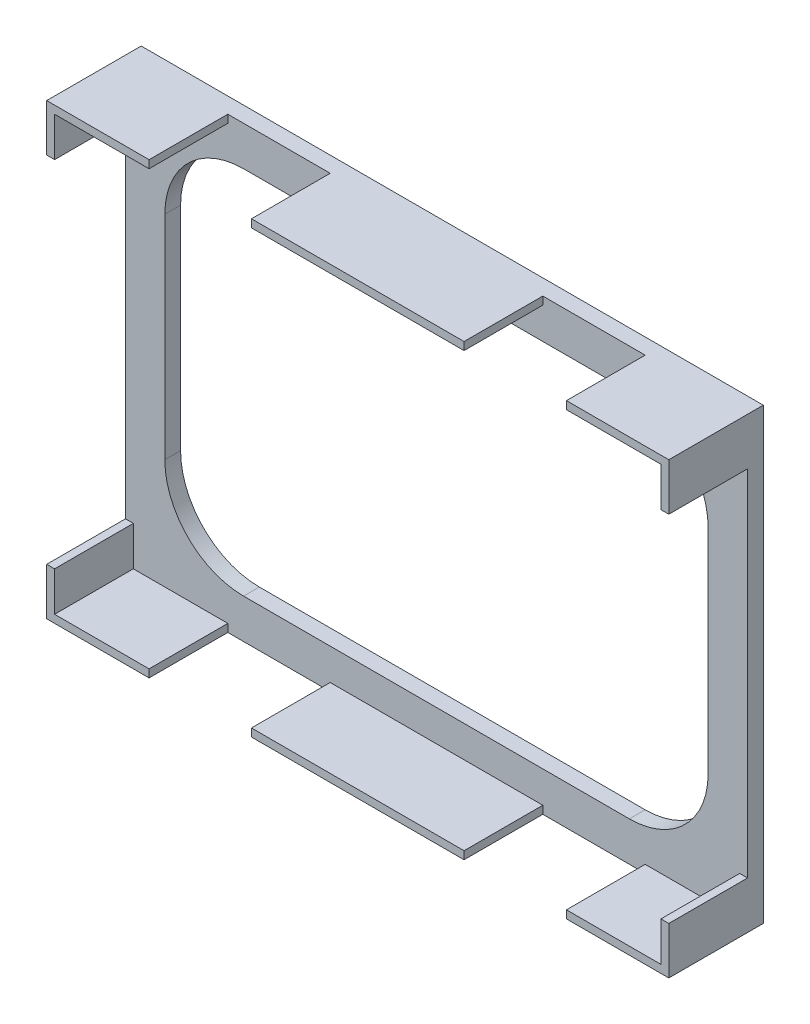
ISO-10303-21;
HEADER;
FILE_DESCRIPTION(('STEP AP214'),'2;1');
FILE_NAME('part.step','',(''),(''),'','','');
FILE_SCHEMA(('AUTOMOTIVE_DESIGN { 1 0 10303 214 1 1 1 1 }'));
ENDSEC;
DATA;
#1=APPLICATION_CONTEXT('core data for automotive mechanical design processes');
#2=APPLICATION_PROTOCOL_DEFINITION('international standard','automotive_design',2000,#1);
#3=PRODUCT_CONTEXT('',#1,'mechanical');
#4=PRODUCT('Part','Part','',(#3));
#5=PRODUCT_RELATED_PRODUCT_CATEGORY('part','',(#4));
#6=PRODUCT_DEFINITION_FORMATION('','',#4);
#7=PRODUCT_DEFINITION_CONTEXT('part definition',#1,'design');
#8=PRODUCT_DEFINITION('design','',#6,#7);
#9=PRODUCT_DEFINITION_SHAPE('','',#8);
#10=(LENGTH_UNIT() NAMED_UNIT(*) SI_UNIT(.MILLI.,.METRE.));
#11=(NAMED_UNIT(*) PLANE_ANGLE_UNIT() SI_UNIT($,.RADIAN.));
#12=(NAMED_UNIT(*) SI_UNIT($,.STERADIAN.) SOLID_ANGLE_UNIT());
#13=UNCERTAINTY_MEASURE_WITH_UNIT(LENGTH_MEASURE(1.E-05),#10,'distance_accuracy_value','');
#14=(GEOMETRIC_REPRESENTATION_CONTEXT(3) GLOBAL_UNCERTAINTY_ASSIGNED_CONTEXT((#13)) GLOBAL_UNIT_ASSIGNED_CONTEXT((#10,
#11,#12)) REPRESENTATION_CONTEXT('',''));
#15=CARTESIAN_POINT('',(0.,0.,0.));
#16=DIRECTION('',(0.,0.,1.));
#17=DIRECTION('',(1.,0.,0.));
#18=AXIS2_PLACEMENT_3D('',#15,#16,#17);
#19=CARTESIAN_POINT('',(0.,0.,12.));
#20=DIRECTION('',(0.,0.,-1.));
#21=DIRECTION('',(-1.,0.,0.));
#22=AXIS2_PLACEMENT_3D('',#19,#20,#21);
#23=PLANE('',#22);
#24=DIRECTION('',(1.,0.,0.));
#25=VECTOR('',#24,1.);
#26=CARTESIAN_POINT('',(1.00000000000001,1.00000000000001,12.));
#27=LINE('',#26,#25);
#28=CARTESIAN_POINT('',(26.,1.,12.));
#29=VERTEX_POINT('',#28);
#30=CARTESIAN_POINT('',(53.,1.,12.));
#31=VERTEX_POINT('',#30);
#32=EDGE_CURVE('E365',#29,#31,#27,.T.);
#33=ORIENTED_EDGE('',*,*,#32,.F.);
#34=DIRECTION('',(0.,-1.,0.));
#35=VECTOR('',#34,1.);
#36=CARTESIAN_POINT('',(26.,100.,12.));
#37=LINE('',#36,#35);
#38=CARTESIAN_POINT('',(26.,0.,12.));
#39=VERTEX_POINT('',#38);
#40=EDGE_CURVE('E496',#29,#39,#37,.T.);
#41=ORIENTED_EDGE('',*,*,#40,.T.);
#42=DIRECTION('',(1.,0.,0.));
#43=VECTOR('',#42,1.);
#44=CARTESIAN_POINT('',(0.,0.,12.));
#45=LINE('',#44,#43);
#46=CARTESIAN_POINT('',(53.,0.,12.));
#47=VERTEX_POINT('',#46);
#48=EDGE_CURVE('E320',#39,#47,#45,.T.);
#49=ORIENTED_EDGE('',*,*,#48,.T.);
#50=DIRECTION('',(0.,-1.,0.));
#51=VECTOR('',#50,1.);
#52=CARTESIAN_POINT('',(53.,100.,12.));
#53=LINE('',#52,#51);
#54=EDGE_CURVE('E474',#31,#47,#53,.T.);
#55=ORIENTED_EDGE('',*,*,#54,.F.);
#56=EDGE_LOOP('',(#33,#41,#49,#55));
#57=FACE_BOUND('',#56,.T.);
#58=ADVANCED_FACE('F33',(#57),#23,.F.);
#59=CARTESIAN_POINT('',(66.,1.,12.));
#60=VERTEX_POINT('',#59);
#61=CARTESIAN_POINT('',(78.,1.00000000000001,12.));
#62=VERTEX_POINT('',#61);
#63=EDGE_CURVE('E366',#60,#62,#27,.T.);
#64=ORIENTED_EDGE('',*,*,#63,.F.);
#65=DIRECTION('',(0.,-1.,0.));
#66=VECTOR('',#65,1.);
#67=CARTESIAN_POINT('',(66.,100.,12.));
#68=LINE('',#67,#66);
#69=CARTESIAN_POINT('',(66.,0.,12.));
#70=VERTEX_POINT('',#69);
#71=EDGE_CURVE('E470',#60,#70,#68,.T.);
#72=ORIENTED_EDGE('',*,*,#71,.T.);
#73=CARTESIAN_POINT('',(79.,0.,12.));
#74=VERTEX_POINT('',#73);
#75=EDGE_CURVE('E322',#70,#74,#45,.T.);
#76=ORIENTED_EDGE('',*,*,#75,.T.);
#77=DIRECTION('',(0.,1.,0.));
#78=VECTOR('',#77,1.);
#79=CARTESIAN_POINT('',(79.,0.,12.));
#80=LINE('',#79,#78);
#81=CARTESIAN_POINT('',(79.,6.,12.));
#82=VERTEX_POINT('',#81);
#83=EDGE_CURVE('E323',#74,#82,#80,.T.);
#84=ORIENTED_EDGE('',*,*,#83,.T.);
#85=DIRECTION('',(1.,0.,0.));
#86=VECTOR('',#85,1.);
#87=CARTESIAN_POINT('',(-21.,6.,12.));
#88=LINE('',#87,#86);
#89=CARTESIAN_POINT('',(78.,6.,12.));
#90=VERTEX_POINT('',#89);
#91=EDGE_CURVE('E417',#90,#82,#88,.T.);
#92=ORIENTED_EDGE('',*,*,#91,.F.);
#93=DIRECTION('',(0.,1.,0.));
#94=VECTOR('',#93,1.);
#95=CARTESIAN_POINT('',(78.,1.00000000000001,12.));
#96=LINE('',#95,#94);
#97=EDGE_CURVE('E359',#62,#90,#96,.T.);
#98=ORIENTED_EDGE('',*,*,#97,.F.);
#99=EDGE_LOOP('',(#64,#72,#76,#84,#92,#98));
#100=FACE_BOUND('',#99,.T.);
#101=ADVANCED_FACE('F588',(#100),#23,.F.);
#102=DIRECTION('',(-1.,0.,0.));
#103=VECTOR('',#102,1.);
#104=CARTESIAN_POINT('',(0.,57.,12.));
#105=LINE('',#104,#103);
#106=CARTESIAN_POINT('',(53.,57.,12.));
#107=VERTEX_POINT('',#106);
#108=CARTESIAN_POINT('',(26.,57.,12.));
#109=VERTEX_POINT('',#108);
#110=EDGE_CURVE('E645',#107,#109,#105,.T.);
#111=ORIENTED_EDGE('',*,*,#110,.T.);
#112=CARTESIAN_POINT('',(26.,56.,12.));
#113=VERTEX_POINT('',#112);
#114=EDGE_CURVE('E469',#109,#113,#37,.T.);
#115=ORIENTED_EDGE('',*,*,#114,.T.);
#116=DIRECTION('',(-1.,0.,0.));
#117=VECTOR('',#116,1.);
#118=CARTESIAN_POINT('',(1.00000000000001,56.,12.));
#119=LINE('',#118,#117);
#120=CARTESIAN_POINT('',(53.,56.,12.));
#121=VERTEX_POINT('',#120);
#122=EDGE_CURVE('E357',#121,#113,#119,.T.);
#123=ORIENTED_EDGE('',*,*,#122,.F.);
#124=EDGE_CURVE('E476',#107,#121,#53,.T.);
#125=ORIENTED_EDGE('',*,*,#124,.F.);
#126=EDGE_LOOP('',(#111,#115,#123,#125));
#127=FACE_BOUND('',#126,.T.);
#128=ADVANCED_FACE('F595',(#127),#23,.F.);
#129=CARTESIAN_POINT('',(79.,57.,12.));
#130=VERTEX_POINT('',#129);
#131=CARTESIAN_POINT('',(66.,57.,12.));
#132=VERTEX_POINT('',#131);
#133=EDGE_CURVE('E639',#130,#132,#105,.T.);
#134=ORIENTED_EDGE('',*,*,#133,.T.);
#135=CARTESIAN_POINT('',(66.,56.,12.));
#136=VERTEX_POINT('',#135);
#137=EDGE_CURVE('E472',#132,#136,#68,.T.);
#138=ORIENTED_EDGE('',*,*,#137,.T.);
#139=CARTESIAN_POINT('',(78.,56.,12.));
#140=VERTEX_POINT('',#139);
#141=EDGE_CURVE('E353',#140,#136,#119,.T.);
#142=ORIENTED_EDGE('',*,*,#141,.F.);
#143=CARTESIAN_POINT('',(78.,51.,12.));
#144=VERTEX_POINT('',#143);
#145=EDGE_CURVE('E362',#144,#140,#96,.T.);
#146=ORIENTED_EDGE('',*,*,#145,.F.);
#147=DIRECTION('',(1.,0.,0.));
#148=VECTOR('',#147,1.);
#149=CARTESIAN_POINT('',(-21.,51.,12.));
#150=LINE('',#149,#148);
#151=CARTESIAN_POINT('',(79.,51.,12.));
#152=VERTEX_POINT('',#151);
#153=EDGE_CURVE('E413',#144,#152,#150,.T.);
#154=ORIENTED_EDGE('',*,*,#153,.T.);
#155=EDGE_CURVE('E319',#152,#130,#80,.T.);
#156=ORIENTED_EDGE('',*,*,#155,.T.);
#157=EDGE_LOOP('',(#134,#138,#142,#146,#154,#156));
#158=FACE_BOUND('',#157,.T.);
#159=ADVANCED_FACE('F613',(#158),#23,.F.);
#160=CARTESIAN_POINT('',(1.00000000000001,56.,2.));
#161=DIRECTION('',(0.,1.,0.));
#162=DIRECTION('',(0.,0.,1.));
#163=AXIS2_PLACEMENT_3D('',#160,#161,#162);
#164=PLANE('',#163);
#165=ORIENTED_EDGE('',*,*,#122,.T.);
#166=DIRECTION('',(0.,0.,-1.));
#167=VECTOR('',#166,1.);
#168=CARTESIAN_POINT('',(26.,56.,2.));
#169=LINE('',#168,#167);
#170=CARTESIAN_POINT('',(26.,56.,2.));
#171=VERTEX_POINT('',#170);
#172=EDGE_CURVE('E438',#113,#171,#169,.T.);
#173=ORIENTED_EDGE('',*,*,#172,.T.);
#174=DIRECTION('',(-1.,0.,0.));
#175=VECTOR('',#174,1.);
#176=CARTESIAN_POINT('',(1.00000000000001,56.,2.));
#177=LINE('',#176,#175);
#178=CARTESIAN_POINT('',(53.,56.,2.));
#179=VERTEX_POINT('',#178);
#180=EDGE_CURVE('E373',#179,#171,#177,.T.);
#181=ORIENTED_EDGE('',*,*,#180,.F.);
#182=DIRECTION('',(0.,0.,1.));
#183=VECTOR('',#182,1.);
#184=CARTESIAN_POINT('',(53.,56.,2.));
#185=LINE('',#184,#183);
#186=EDGE_CURVE('E463',#179,#121,#185,.T.);
#187=ORIENTED_EDGE('',*,*,#186,.T.);
#188=EDGE_LOOP('',(#165,#173,#181,#187));
#189=FACE_BOUND('',#188,.T.);
#190=ADVANCED_FACE('F625',(#189),#164,.F.);
#191=ORIENTED_EDGE('',*,*,#141,.T.);
#192=DIRECTION('',(0.,0.,-1.));
#193=VECTOR('',#192,1.);
#194=CARTESIAN_POINT('',(66.,56.,2.));
#195=LINE('',#194,#193);
#196=CARTESIAN_POINT('',(66.,56.,2.));
#197=VERTEX_POINT('',#196);
#198=EDGE_CURVE('E454',#136,#197,#195,.T.);
#199=ORIENTED_EDGE('',*,*,#198,.T.);
#200=CARTESIAN_POINT('',(78.,56.,2.));
#201=VERTEX_POINT('',#200);
#202=EDGE_CURVE('E343',#201,#197,#177,.T.);
#203=ORIENTED_EDGE('',*,*,#202,.F.);
#204=DIRECTION('',(0.,0.,1.));
#205=VECTOR('',#204,1.);
#206=CARTESIAN_POINT('',(78.,56.,2.));
#207=LINE('',#206,#205);
#208=EDGE_CURVE('E346',#201,#140,#207,.T.);
#209=ORIENTED_EDGE('',*,*,#208,.T.);
#210=EDGE_LOOP('',(#191,#199,#203,#209));
#211=FACE_BOUND('',#210,.T.);
#212=ADVANCED_FACE('F631',(#211),#164,.F.);
#213=CARTESIAN_POINT('',(1.00000000000001,1.00000000000001,2.));
#214=DIRECTION('',(0.,-1.,0.));
#215=DIRECTION('',(0.,0.,-1.));
#216=AXIS2_PLACEMENT_3D('',#213,#214,#215);
#217=PLANE('',#216);
#218=DIRECTION('',(1.,0.,0.));
#219=VECTOR('',#218,1.);
#220=CARTESIAN_POINT('',(1.00000000000001,1.00000000000001,2.));
#221=LINE('',#220,#219);
#222=CARTESIAN_POINT('',(26.,1.,2.));
#223=VERTEX_POINT('',#222);
#224=CARTESIAN_POINT('',(53.,1.00000000000001,2.));
#225=VERTEX_POINT('',#224);
#226=EDGE_CURVE('E382',#223,#225,#221,.T.);
#227=ORIENTED_EDGE('',*,*,#226,.F.);
#228=DIRECTION('',(0.,0.,1.));
#229=VECTOR('',#228,1.);
#230=CARTESIAN_POINT('',(26.,1.00000000000001,2.));
#231=LINE('',#230,#229);
#232=EDGE_CURVE('E441',#223,#29,#231,.T.);
#233=ORIENTED_EDGE('',*,*,#232,.T.);
#234=ORIENTED_EDGE('',*,*,#32,.T.);
#235=DIRECTION('',(0.,0.,-1.));
#236=VECTOR('',#235,1.);
#237=CARTESIAN_POINT('',(53.,1.00000000000001,2.));
#238=LINE('',#237,#236);
#239=EDGE_CURVE('E466',#31,#225,#238,.T.);
#240=ORIENTED_EDGE('',*,*,#239,.T.);
#241=EDGE_LOOP('',(#227,#233,#234,#240));
#242=FACE_BOUND('',#241,.T.);
#243=ADVANCED_FACE('F620',(#242),#217,.F.);
#244=CARTESIAN_POINT('',(66.,1.,2.));
#245=VERTEX_POINT('',#244);
#246=CARTESIAN_POINT('',(78.,1.00000000000001,2.));
#247=VERTEX_POINT('',#246);
#248=EDGE_CURVE('E383',#245,#247,#221,.T.);
#249=ORIENTED_EDGE('',*,*,#248,.F.);
#250=DIRECTION('',(0.,0.,1.));
#251=VECTOR('',#250,1.);
#252=CARTESIAN_POINT('',(66.,1.00000000000001,2.));
#253=LINE('',#252,#251);
#254=EDGE_CURVE('E457',#245,#60,#253,.T.);
#255=ORIENTED_EDGE('',*,*,#254,.T.);
#256=ORIENTED_EDGE('',*,*,#63,.T.);
#257=DIRECTION('',(0.,0.,1.));
#258=VECTOR('',#257,1.);
#259=CARTESIAN_POINT('',(78.,1.00000000000001,2.));
#260=LINE('',#259,#258);
#261=EDGE_CURVE('E342',#247,#62,#260,.T.);
#262=ORIENTED_EDGE('',*,*,#261,.F.);
#263=EDGE_LOOP('',(#249,#255,#256,#262));
#264=FACE_BOUND('',#263,.T.);
#265=ADVANCED_FACE('F612',(#264),#217,.F.);
#266=CARTESIAN_POINT('',(0.,0.,12.));
#267=VERTEX_POINT('',#266);
#268=CARTESIAN_POINT('',(13.,0.,12.));
#269=VERTEX_POINT('',#268);
#270=EDGE_CURVE('E308',#267,#269,#45,.T.);
#271=ORIENTED_EDGE('',*,*,#270,.T.);
#272=DIRECTION('',(0.,-1.,0.));
#273=VECTOR('',#272,1.);
#274=CARTESIAN_POINT('',(13.,100.,12.));
#275=LINE('',#274,#273);
#276=CARTESIAN_POINT('',(13.,1.,12.));
#277=VERTEX_POINT('',#276);
#278=EDGE_CURVE('E289',#277,#269,#275,.T.);
#279=ORIENTED_EDGE('',*,*,#278,.F.);
#280=CARTESIAN_POINT('',(1.00000000000001,1.00000000000001,12.));
#281=VERTEX_POINT('',#280);
#282=EDGE_CURVE('E363',#281,#277,#27,.T.);
#283=ORIENTED_EDGE('',*,*,#282,.F.);
#284=DIRECTION('',(0.,-1.,0.));
#285=VECTOR('',#284,1.);
#286=CARTESIAN_POINT('',(1.00000000000001,1.00000000000001,12.));
#287=LINE('',#286,#285);
#288=CARTESIAN_POINT('',(1.00000000000001,6.,12.));
#289=VERTEX_POINT('',#288);
#290=EDGE_CURVE('E370',#289,#281,#287,.T.);
#291=ORIENTED_EDGE('',*,*,#290,.F.);
#292=CARTESIAN_POINT('',(0.,6.,12.));
#293=VERTEX_POINT('',#292);
#294=EDGE_CURVE('E419',#293,#289,#88,.T.);
#295=ORIENTED_EDGE('',*,*,#294,.F.);
#296=DIRECTION('',(0.,-1.,0.));
#297=VECTOR('',#296,1.);
#298=CARTESIAN_POINT('',(0.,0.,12.));
#299=LINE('',#298,#297);
#300=EDGE_CURVE('E318',#293,#267,#299,.T.);
#301=ORIENTED_EDGE('',*,*,#300,.T.);
#302=EDGE_LOOP('',(#271,#279,#283,#291,#295,#301));
#303=FACE_BOUND('',#302,.T.);
#304=ADVANCED_FACE('F315',(#303),#23,.F.);
#305=CARTESIAN_POINT('',(1.00000000000001,1.00000000000001,2.));
#306=DIRECTION('',(-1.,0.,0.));
#307=DIRECTION('',(0.,0.,1.));
#308=AXIS2_PLACEMENT_3D('',#305,#306,#307);
#309=PLANE('',#308);
#310=DIRECTION('',(0.,-1.,0.));
#311=VECTOR('',#310,1.);
#312=CARTESIAN_POINT('',(1.00000000000001,1.00000000000001,2.));
#313=LINE('',#312,#311);
#314=CARTESIAN_POINT('',(1.00000000000001,6.,2.));
#315=VERTEX_POINT('',#314);
#316=CARTESIAN_POINT('',(1.00000000000001,1.00000000000001,2.));
#317=VERTEX_POINT('',#316);
#318=EDGE_CURVE('E356',#315,#317,#313,.T.);
#319=ORIENTED_EDGE('',*,*,#318,.F.);
#320=DIRECTION('',(0.,0.,1.));
#321=VECTOR('',#320,1.);
#322=CARTESIAN_POINT('',(1.00000000000001,6.,2.));
#323=LINE('',#322,#321);
#324=EDGE_CURVE('E393',#315,#289,#323,.T.);
#325=ORIENTED_EDGE('',*,*,#324,.T.);
#326=ORIENTED_EDGE('',*,*,#290,.T.);
#327=DIRECTION('',(0.,0.,1.));
#328=VECTOR('',#327,1.);
#329=CARTESIAN_POINT('',(1.00000000000001,1.00000000000001,2.));
#330=LINE('',#329,#328);
#331=EDGE_CURVE('E339',#317,#281,#330,.T.);
#332=ORIENTED_EDGE('',*,*,#331,.F.);
#333=EDGE_LOOP('',(#319,#325,#326,#332));
#334=FACE_BOUND('',#333,.T.);
#335=ADVANCED_FACE('F611',(#334),#309,.F.);
#336=CARTESIAN_POINT('',(78.,1.00000000000001,2.));
#337=DIRECTION('',(1.,0.,0.));
#338=DIRECTION('',(0.,0.,-1.));
#339=AXIS2_PLACEMENT_3D('',#336,#337,#338);
#340=PLANE('',#339);
#341=ORIENTED_EDGE('',*,*,#97,.T.);
#342=DIRECTION('',(0.,0.,-1.));
#343=VECTOR('',#342,1.);
#344=CARTESIAN_POINT('',(78.,6.,2.));
#345=LINE('',#344,#343);
#346=CARTESIAN_POINT('',(78.,6.,2.));
#347=VERTEX_POINT('',#346);
#348=EDGE_CURVE('E396',#90,#347,#345,.T.);
#349=ORIENTED_EDGE('',*,*,#348,.T.);
#350=DIRECTION('',(0.,1.,0.));
#351=VECTOR('',#350,1.);
#352=CARTESIAN_POINT('',(78.,1.00000000000001,2.));
#353=LINE('',#352,#351);
#354=EDGE_CURVE('E375',#247,#347,#353,.T.);
#355=ORIENTED_EDGE('',*,*,#354,.F.);
#356=ORIENTED_EDGE('',*,*,#261,.T.);
#357=EDGE_LOOP('',(#341,#349,#355,#356));
#358=FACE_BOUND('',#357,.T.);
#359=ADVANCED_FACE('F618',(#358),#340,.F.);
#360=CARTESIAN_POINT('',(0.,0.,12.));
#361=DIRECTION('',(1.,0.,0.));
#362=DIRECTION('',(0.,0.,-1.));
#363=AXIS2_PLACEMENT_3D('',#360,#361,#362);
#364=PLANE('',#363);
#365=ORIENTED_EDGE('',*,*,#300,.F.);
#366=DIRECTION('',(0.,0.,-1.));
#367=VECTOR('',#366,1.);
#368=CARTESIAN_POINT('',(0.,6.,12.));
#369=LINE('',#368,#367);
#370=CARTESIAN_POINT('',(0.,6.,2.));
#371=VERTEX_POINT('',#370);
#372=EDGE_CURVE('E390',#293,#371,#369,.T.);
#373=ORIENTED_EDGE('',*,*,#372,.T.);
#374=DIRECTION('',(0.,1.,0.));
#375=VECTOR('',#374,1.);
#376=CARTESIAN_POINT('',(0.,0.,2.));
#377=LINE('',#376,#375);
#378=CARTESIAN_POINT('',(0.,51.,2.));
#379=VERTEX_POINT('',#378);
#380=EDGE_CURVE('E387',#371,#379,#377,.T.);
#381=ORIENTED_EDGE('',*,*,#380,.T.);
#382=DIRECTION('',(0.,0.,1.));
#383=VECTOR('',#382,1.);
#384=CARTESIAN_POINT('',(0.,51.,12.));
#385=LINE('',#384,#383);
#386=CARTESIAN_POINT('',(0.,51.,12.));
#387=VERTEX_POINT('',#386);
#388=EDGE_CURVE('E399',#379,#387,#385,.T.);
#389=ORIENTED_EDGE('',*,*,#388,.T.);
#390=CARTESIAN_POINT('',(0.,57.,12.));
#391=VERTEX_POINT('',#390);
#392=EDGE_CURVE('E327',#391,#387,#299,.T.);
#393=ORIENTED_EDGE('',*,*,#392,.F.);
#394=DIRECTION('',(0.,0.,-1.));
#395=VECTOR('',#394,1.);
#396=CARTESIAN_POINT('',(0.,57.,12.));
#397=LINE('',#396,#395);
#398=CARTESIAN_POINT('',(0.,57.,0.));
#399=VERTEX_POINT('',#398);
#400=EDGE_CURVE('E644',#391,#399,#397,.T.);
#401=ORIENTED_EDGE('',*,*,#400,.T.);
#402=DIRECTION('',(0.,-1.,0.));
#403=VECTOR('',#402,1.);
#404=CARTESIAN_POINT('',(0.,0.,0.));
#405=LINE('',#404,#403);
#406=CARTESIAN_POINT('',(0.,0.,0.));
#407=VERTEX_POINT('',#406);
#408=EDGE_CURVE('E352',#399,#407,#405,.T.);
#409=ORIENTED_EDGE('',*,*,#408,.T.);
#410=DIRECTION('',(0.,0.,-1.));
#411=VECTOR('',#410,1.);
#412=CARTESIAN_POINT('',(0.,0.,12.));
#413=LINE('',#412,#411);
#414=EDGE_CURVE('E575',#267,#407,#413,.T.);
#415=ORIENTED_EDGE('',*,*,#414,.F.);
#416=EDGE_LOOP('',(#365,#373,#381,#389,#393,#401,#409,#415));
#417=FACE_BOUND('',#416,.T.);
#418=ADVANCED_FACE('F734',(#417),#364,.F.);
#419=CARTESIAN_POINT('',(0.,0.,12.));
#420=DIRECTION('',(0.,1.,0.));
#421=DIRECTION('',(0.,0.,1.));
#422=AXIS2_PLACEMENT_3D('',#419,#420,#421);
#423=PLANE('',#422);
#424=ORIENTED_EDGE('',*,*,#48,.F.);
#425=DIRECTION('',(0.,0.,1.));
#426=VECTOR('',#425,1.);
#427=CARTESIAN_POINT('',(26.,0.,2.));
#428=LINE('',#427,#426);
#429=CARTESIAN_POINT('',(26.,0.,2.));
#430=VERTEX_POINT('',#429);
#431=EDGE_CURVE('E301',#430,#39,#428,.T.);
#432=ORIENTED_EDGE('',*,*,#431,.F.);
#433=DIRECTION('',(1.,0.,0.));
#434=VECTOR('',#433,1.);
#435=CARTESIAN_POINT('',(13.,0.,2.));
#436=LINE('',#435,#434);
#437=CARTESIAN_POINT('',(13.,0.,2.));
#438=VERTEX_POINT('',#437);
#439=EDGE_CURVE('E312',#438,#430,#436,.T.);
#440=ORIENTED_EDGE('',*,*,#439,.F.);
#441=DIRECTION('',(0.,0.,-1.));
#442=VECTOR('',#441,1.);
#443=CARTESIAN_POINT('',(13.,0.,2.));
#444=LINE('',#443,#442);
#445=EDGE_CURVE('E292',#269,#438,#444,.T.);
#446=ORIENTED_EDGE('',*,*,#445,.F.);
#447=ORIENTED_EDGE('',*,*,#270,.F.);
#448=ORIENTED_EDGE('',*,*,#414,.T.);
#449=DIRECTION('',(1.,0.,0.));
#450=VECTOR('',#449,1.);
#451=CARTESIAN_POINT('',(0.,0.,0.));
#452=LINE('',#451,#450);
#453=CARTESIAN_POINT('',(79.,0.,0.));
#454=VERTEX_POINT('',#453);
#455=EDGE_CURVE('E746',#407,#454,#452,.T.);
#456=ORIENTED_EDGE('',*,*,#455,.T.);
#457=DIRECTION('',(0.,0.,-1.));
#458=VECTOR('',#457,1.);
#459=CARTESIAN_POINT('',(79.,0.,12.));
#460=LINE('',#459,#458);
#461=EDGE_CURVE('E664',#74,#454,#460,.T.);
#462=ORIENTED_EDGE('',*,*,#461,.F.);
#463=ORIENTED_EDGE('',*,*,#75,.F.);
#464=DIRECTION('',(0.,0.,1.));
#465=VECTOR('',#464,1.);
#466=CARTESIAN_POINT('',(66.,0.,2.));
#467=LINE('',#466,#465);
#468=CARTESIAN_POINT('',(66.,0.,2.));
#469=VERTEX_POINT('',#468);
#470=EDGE_CURVE('E487',#469,#70,#467,.T.);
#471=ORIENTED_EDGE('',*,*,#470,.F.);
#472=DIRECTION('',(1.,0.,0.));
#473=VECTOR('',#472,1.);
#474=CARTESIAN_POINT('',(53.,0.,2.));
#475=LINE('',#474,#473);
#476=CARTESIAN_POINT('',(53.,0.,2.));
#477=VERTEX_POINT('',#476);
#478=EDGE_CURVE('E473',#477,#469,#475,.T.);
#479=ORIENTED_EDGE('',*,*,#478,.F.);
#480=DIRECTION('',(0.,0.,-1.));
#481=VECTOR('',#480,1.);
#482=CARTESIAN_POINT('',(53.,0.,2.));
#483=LINE('',#482,#481);
#484=EDGE_CURVE('E484',#47,#477,#483,.T.);
#485=ORIENTED_EDGE('',*,*,#484,.F.);
#486=EDGE_LOOP('',(#424,#432,#440,#446,#447,#448,#456,#462,#463,#471,#479,#485));
#487=FACE_BOUND('',#486,.T.);
#488=ADVANCED_FACE('F306',(#487),#423,.F.);
#489=CARTESIAN_POINT('',(79.,0.,12.));
#490=DIRECTION('',(-1.,0.,0.));
#491=DIRECTION('',(0.,0.,1.));
#492=AXIS2_PLACEMENT_3D('',#489,#490,#491);
#493=PLANE('',#492);
#494=DIRECTION('',(0.,1.,0.));
#495=VECTOR('',#494,1.);
#496=CARTESIAN_POINT('',(79.,6.,2.));
#497=LINE('',#496,#495);
#498=CARTESIAN_POINT('',(79.,6.,2.));
#499=VERTEX_POINT('',#498);
#500=CARTESIAN_POINT('',(79.,51.,2.));
#501=VERTEX_POINT('',#500);
#502=EDGE_CURVE('E426',#499,#501,#497,.T.);
#503=ORIENTED_EDGE('',*,*,#502,.F.);
#504=DIRECTION('',(0.,0.,-1.));
#505=VECTOR('',#504,1.);
#506=CARTESIAN_POINT('',(79.,6.,2.));
#507=LINE('',#506,#505);
#508=EDGE_CURVE('E412',#82,#499,#507,.T.);
#509=ORIENTED_EDGE('',*,*,#508,.F.);
#510=ORIENTED_EDGE('',*,*,#83,.F.);
#511=ORIENTED_EDGE('',*,*,#461,.T.);
#512=DIRECTION('',(0.,1.,0.));
#513=VECTOR('',#512,1.);
#514=CARTESIAN_POINT('',(79.,0.,0.));
#515=LINE('',#514,#513);
#516=CARTESIAN_POINT('',(79.,57.,0.));
#517=VERTEX_POINT('',#516);
#518=EDGE_CURVE('E744',#454,#517,#515,.T.);
#519=ORIENTED_EDGE('',*,*,#518,.T.);
#520=DIRECTION('',(0.,0.,-1.));
#521=VECTOR('',#520,1.);
#522=CARTESIAN_POINT('',(79.,57.,12.));
#523=LINE('',#522,#521);
#524=EDGE_CURVE('E649',#130,#517,#523,.T.);
#525=ORIENTED_EDGE('',*,*,#524,.F.);
#526=ORIENTED_EDGE('',*,*,#155,.F.);
#527=DIRECTION('',(0.,0.,1.));
#528=VECTOR('',#527,1.);
#529=CARTESIAN_POINT('',(79.,51.,2.));
#530=LINE('',#529,#528);
#531=EDGE_CURVE('E424',#501,#152,#530,.T.);
#532=ORIENTED_EDGE('',*,*,#531,.F.);
#533=EDGE_LOOP('',(#503,#509,#510,#511,#519,#525,#526,#532));
#534=FACE_BOUND('',#533,.T.);
#535=ADVANCED_FACE('F606',(#534),#493,.F.);
#536=CARTESIAN_POINT('',(0.,57.,12.));
#537=DIRECTION('',(0.,-1.,0.));
#538=DIRECTION('',(0.,0.,-1.));
#539=AXIS2_PLACEMENT_3D('',#536,#537,#538);
#540=PLANE('',#539);
#541=DIRECTION('',(1.,0.,0.));
#542=VECTOR('',#541,1.);
#543=CARTESIAN_POINT('',(0.,57.,2.));
#544=LINE('',#543,#542);
#545=CARTESIAN_POINT('',(13.,57.,2.));
#546=VERTEX_POINT('',#545);
#547=CARTESIAN_POINT('',(26.,57.,2.));
#548=VERTEX_POINT('',#547);
#549=EDGE_CURVE('E429',#546,#548,#544,.T.);
#550=ORIENTED_EDGE('',*,*,#549,.T.);
#551=DIRECTION('',(0.,0.,1.));
#552=VECTOR('',#551,1.);
#553=CARTESIAN_POINT('',(26.,57.,12.));
#554=LINE('',#553,#552);
#555=EDGE_CURVE('E435',#548,#109,#554,.T.);
#556=ORIENTED_EDGE('',*,*,#555,.T.);
#557=ORIENTED_EDGE('',*,*,#110,.F.);
#558=DIRECTION('',(0.,0.,-1.));
#559=VECTOR('',#558,1.);
#560=CARTESIAN_POINT('',(53.,57.,12.));
#561=LINE('',#560,#559);
#562=CARTESIAN_POINT('',(53.,57.,2.));
#563=VERTEX_POINT('',#562);
#564=EDGE_CURVE('E460',#107,#563,#561,.T.);
#565=ORIENTED_EDGE('',*,*,#564,.T.);
#566=DIRECTION('',(1.,0.,0.));
#567=VECTOR('',#566,1.);
#568=CARTESIAN_POINT('',(0.,57.,2.));
#569=LINE('',#568,#567);
#570=CARTESIAN_POINT('',(66.,57.,2.));
#571=VERTEX_POINT('',#570);
#572=EDGE_CURVE('E432',#563,#571,#569,.T.);
#573=ORIENTED_EDGE('',*,*,#572,.T.);
#574=DIRECTION('',(0.,0.,1.));
#575=VECTOR('',#574,1.);
#576=CARTESIAN_POINT('',(66.,57.,12.));
#577=LINE('',#576,#575);
#578=EDGE_CURVE('E451',#571,#132,#577,.T.);
#579=ORIENTED_EDGE('',*,*,#578,.T.);
#580=ORIENTED_EDGE('',*,*,#133,.F.);
#581=ORIENTED_EDGE('',*,*,#524,.T.);
#582=DIRECTION('',(-1.,0.,0.));
#583=VECTOR('',#582,1.);
#584=CARTESIAN_POINT('',(0.,57.,0.));
#585=LINE('',#584,#583);
#586=EDGE_CURVE('E337',#517,#399,#585,.T.);
#587=ORIENTED_EDGE('',*,*,#586,.T.);
#588=ORIENTED_EDGE('',*,*,#400,.F.);
#589=CARTESIAN_POINT('',(13.,57.,12.));
#590=VERTEX_POINT('',#589);
#591=EDGE_CURVE('E647',#590,#391,#105,.T.);
#592=ORIENTED_EDGE('',*,*,#591,.F.);
#593=DIRECTION('',(0.,0.,-1.));
#594=VECTOR('',#593,1.);
#595=CARTESIAN_POINT('',(13.,57.,12.));
#596=LINE('',#595,#594);
#597=EDGE_CURVE('E444',#590,#546,#596,.T.);
#598=ORIENTED_EDGE('',*,*,#597,.T.);
#599=EDGE_LOOP('',(#550,#556,#557,#565,#573,#579,#580,#581,#587,#588,#592,#598));
#600=FACE_BOUND('',#599,.T.);
#601=ADVANCED_FACE('F600',(#600),#540,.F.);
#602=CARTESIAN_POINT('',(13.,56.,12.));
#603=VERTEX_POINT('',#602);
#604=CARTESIAN_POINT('',(1.00000000000001,56.,12.));
#605=VERTEX_POINT('',#604);
#606=EDGE_CURVE('E358',#603,#605,#119,.T.);
#607=ORIENTED_EDGE('',*,*,#606,.F.);
#608=EDGE_CURVE('E300',#590,#603,#275,.T.);
#609=ORIENTED_EDGE('',*,*,#608,.F.);
#610=ORIENTED_EDGE('',*,*,#591,.T.);
#611=ORIENTED_EDGE('',*,*,#392,.T.);
#612=CARTESIAN_POINT('',(1.00000000000001,51.,12.));
#613=VERTEX_POINT('',#612);
#614=EDGE_CURVE('E416',#387,#613,#150,.T.);
#615=ORIENTED_EDGE('',*,*,#614,.T.);
#616=EDGE_CURVE('E367',#605,#613,#287,.T.);
#617=ORIENTED_EDGE('',*,*,#616,.F.);
#618=EDGE_LOOP('',(#607,#609,#610,#611,#615,#617));
#619=FACE_BOUND('',#618,.T.);
#620=ADVANCED_FACE('F591',(#619),#23,.F.);
#621=CARTESIAN_POINT('',(0.,0.,0.));
#622=DIRECTION('',(0.,0.,-1.));
#623=DIRECTION('',(-1.,0.,0.));
#624=AXIS2_PLACEMENT_3D('',#621,#622,#623);
#625=PLANE('',#624);
#626=DIRECTION('',(0.,1.,0.));
#627=VECTOR('',#626,1.);
#628=CARTESIAN_POINT('',(5.,0.,0.));
#629=LINE('',#628,#627);
#630=CARTESIAN_POINT('',(5.,15.,0.));
#631=VERTEX_POINT('',#630);
#632=CARTESIAN_POINT('',(5.,42.,0.));
#633=VERTEX_POINT('',#632);
#634=EDGE_CURVE('E488',#631,#633,#629,.T.);
#635=ORIENTED_EDGE('',*,*,#634,.F.);
#636=CARTESIAN_POINT('',(15.,15.,0.));
#637=DIRECTION('',(0.,0.,-1.));
#638=DIRECTION('',(-1.,0.,0.));
#639=AXIS2_PLACEMENT_3D('',#636,#637,#638);
#640=CIRCLE('',#639,10.);
#641=CARTESIAN_POINT('',(15.,5.,0.));
#642=VERTEX_POINT('',#641);
#643=EDGE_CURVE('E535',#631,#642,#640,.F.);
#644=ORIENTED_EDGE('',*,*,#643,.T.);
#645=DIRECTION('',(-1.,0.,0.));
#646=VECTOR('',#645,1.);
#647=CARTESIAN_POINT('',(0.,5.,0.));
#648=LINE('',#647,#646);
#649=CARTESIAN_POINT('',(64.,5.,0.));
#650=VERTEX_POINT('',#649);
#651=EDGE_CURVE('E507',#650,#642,#648,.T.);
#652=ORIENTED_EDGE('',*,*,#651,.F.);
#653=CARTESIAN_POINT('',(64.,15.,0.));
#654=DIRECTION('',(0.,0.,-1.));
#655=DIRECTION('',(-1.,0.,0.));
#656=AXIS2_PLACEMENT_3D('',#653,#654,#655);
#657=CIRCLE('',#656,10.);
#658=CARTESIAN_POINT('',(74.,15.,0.));
#659=VERTEX_POINT('',#658);
#660=EDGE_CURVE('E551',#650,#659,#657,.F.);
#661=ORIENTED_EDGE('',*,*,#660,.T.);
#662=DIRECTION('',(0.,-1.,0.));
#663=VECTOR('',#662,1.);
#664=CARTESIAN_POINT('',(74.,0.,0.));
#665=LINE('',#664,#663);
#666=CARTESIAN_POINT('',(74.,42.,0.));
#667=VERTEX_POINT('',#666);
#668=EDGE_CURVE('E505',#667,#659,#665,.T.);
#669=ORIENTED_EDGE('',*,*,#668,.F.);
#670=CARTESIAN_POINT('',(64.,42.,0.));
#671=DIRECTION('',(0.,0.,-1.));
#672=DIRECTION('',(-1.,0.,0.));
#673=AXIS2_PLACEMENT_3D('',#670,#671,#672);
#674=CIRCLE('',#673,10.);
#675=CARTESIAN_POINT('',(64.,52.,0.));
#676=VERTEX_POINT('',#675);
#677=EDGE_CURVE('E11',#667,#676,#674,.F.);
#678=ORIENTED_EDGE('',*,*,#677,.T.);
#679=DIRECTION('',(1.,0.,0.));
#680=VECTOR('',#679,1.);
#681=CARTESIAN_POINT('',(0.,52.,0.));
#682=LINE('',#681,#680);
#683=CARTESIAN_POINT('',(15.,52.,0.));
#684=VERTEX_POINT('',#683);
#685=EDGE_CURVE('E502',#684,#676,#682,.T.);
#686=ORIENTED_EDGE('',*,*,#685,.F.);
#687=CARTESIAN_POINT('',(15.,42.,0.));
#688=DIRECTION('',(0.,0.,-1.));
#689=DIRECTION('',(-1.,0.,0.));
#690=AXIS2_PLACEMENT_3D('',#687,#688,#689);
#691=CIRCLE('',#690,10.);
#692=EDGE_CURVE('E539',#684,#633,#691,.F.);
#693=ORIENTED_EDGE('',*,*,#692,.T.);
#694=EDGE_LOOP('',(#635,#644,#652,#661,#669,#678,#686,#693));
#695=FACE_BOUND('',#694,.T.);
#696=ORIENTED_EDGE('',*,*,#408,.F.);
#697=ORIENTED_EDGE('',*,*,#586,.F.);
#698=ORIENTED_EDGE('',*,*,#518,.F.);
#699=ORIENTED_EDGE('',*,*,#455,.F.);
#700=EDGE_LOOP('',(#696,#697,#698,#699));
#701=FACE_BOUND('',#700,.T.);
#702=ADVANCED_FACE('F579',(#695,#701),#625,.T.);
#703=ORIENTED_EDGE('',*,*,#616,.T.);
#704=DIRECTION('',(0.,0.,-1.));
#705=VECTOR('',#704,1.);
#706=CARTESIAN_POINT('',(1.00000000000001,51.,2.));
#707=LINE('',#706,#705);
#708=CARTESIAN_POINT('',(1.00000000000001,51.,2.));
#709=VERTEX_POINT('',#708);
#710=EDGE_CURVE('E402',#613,#709,#707,.T.);
#711=ORIENTED_EDGE('',*,*,#710,.T.);
#712=CARTESIAN_POINT('',(1.00000000000001,56.,2.));
#713=VERTEX_POINT('',#712);
#714=EDGE_CURVE('E384',#713,#709,#313,.T.);
#715=ORIENTED_EDGE('',*,*,#714,.F.);
#716=DIRECTION('',(0.,0.,1.));
#717=VECTOR('',#716,1.);
#718=CARTESIAN_POINT('',(1.00000000000001,56.,2.));
#719=LINE('',#718,#717);
#720=EDGE_CURVE('E349',#713,#605,#719,.T.);
#721=ORIENTED_EDGE('',*,*,#720,.T.);
#722=EDGE_LOOP('',(#703,#711,#715,#721));
#723=FACE_BOUND('',#722,.T.);
#724=ADVANCED_FACE('F605',(#723),#309,.F.);
#725=CARTESIAN_POINT('',(13.,56.,2.));
#726=VERTEX_POINT('',#725);
#727=EDGE_CURVE('E374',#726,#713,#177,.T.);
#728=ORIENTED_EDGE('',*,*,#727,.F.);
#729=DIRECTION('',(0.,0.,1.));
#730=VECTOR('',#729,1.);
#731=CARTESIAN_POINT('',(13.,56.,2.));
#732=LINE('',#731,#730);
#733=EDGE_CURVE('E447',#726,#603,#732,.T.);
#734=ORIENTED_EDGE('',*,*,#733,.T.);
#735=ORIENTED_EDGE('',*,*,#606,.T.);
#736=ORIENTED_EDGE('',*,*,#720,.F.);
#737=EDGE_LOOP('',(#728,#734,#735,#736));
#738=FACE_BOUND('',#737,.T.);
#739=ADVANCED_FACE('F634',(#738),#164,.F.);
#740=CARTESIAN_POINT('',(78.,51.,2.));
#741=VERTEX_POINT('',#740);
#742=EDGE_CURVE('E378',#741,#201,#353,.T.);
#743=ORIENTED_EDGE('',*,*,#742,.F.);
#744=DIRECTION('',(0.,0.,1.));
#745=VECTOR('',#744,1.);
#746=CARTESIAN_POINT('',(78.,51.,2.));
#747=LINE('',#746,#745);
#748=EDGE_CURVE('E405',#741,#144,#747,.T.);
#749=ORIENTED_EDGE('',*,*,#748,.T.);
#750=ORIENTED_EDGE('',*,*,#145,.T.);
#751=ORIENTED_EDGE('',*,*,#208,.F.);
#752=EDGE_LOOP('',(#743,#749,#750,#751));
#753=FACE_BOUND('',#752,.T.);
#754=ADVANCED_FACE('F754',(#753),#340,.F.);
#755=ORIENTED_EDGE('',*,*,#282,.T.);
#756=DIRECTION('',(0.,0.,-1.));
#757=VECTOR('',#756,1.);
#758=CARTESIAN_POINT('',(13.,1.00000000000001,2.));
#759=LINE('',#758,#757);
#760=CARTESIAN_POINT('',(13.,1.00000000000001,2.));
#761=VERTEX_POINT('',#760);
#762=EDGE_CURVE('E295',#277,#761,#759,.T.);
#763=ORIENTED_EDGE('',*,*,#762,.T.);
#764=EDGE_CURVE('E379',#317,#761,#221,.T.);
#765=ORIENTED_EDGE('',*,*,#764,.F.);
#766=ORIENTED_EDGE('',*,*,#331,.T.);
#767=EDGE_LOOP('',(#755,#763,#765,#766));
#768=FACE_BOUND('',#767,.T.);
#769=ADVANCED_FACE('F623',(#768),#217,.F.);
#770=CARTESIAN_POINT('',(0.,0.,2.));
#771=DIRECTION('',(0.,0.,-1.));
#772=DIRECTION('',(-1.,0.,0.));
#773=AXIS2_PLACEMENT_3D('',#770,#771,#772);
#774=PLANE('',#773);
#775=DIRECTION('',(1.,0.,0.));
#776=VECTOR('',#775,1.);
#777=CARTESIAN_POINT('',(5.,5.,2.));
#778=LINE('',#777,#776);
#779=CARTESIAN_POINT('',(15.,5.,2.));
#780=VERTEX_POINT('',#779);
#781=CARTESIAN_POINT('',(64.,5.,2.));
#782=VERTEX_POINT('',#781);
#783=EDGE_CURVE('E513',#780,#782,#778,.T.);
#784=ORIENTED_EDGE('',*,*,#783,.F.);
#785=CARTESIAN_POINT('',(15.,15.,2.));
#786=DIRECTION('',(0.,0.,-1.));
#787=DIRECTION('',(-1.,0.,0.));
#788=AXIS2_PLACEMENT_3D('',#785,#786,#787);
#789=CIRCLE('',#788,10.);
#790=CARTESIAN_POINT('',(5.,15.,2.));
#791=VERTEX_POINT('',#790);
#792=EDGE_CURVE('E532',#780,#791,#789,.T.);
#793=ORIENTED_EDGE('',*,*,#792,.T.);
#794=DIRECTION('',(0.,-1.,0.));
#795=VECTOR('',#794,1.);
#796=CARTESIAN_POINT('',(5.,52.,2.));
#797=LINE('',#796,#795);
#798=CARTESIAN_POINT('',(5.,42.,2.));
#799=VERTEX_POINT('',#798);
#800=EDGE_CURVE('E516',#799,#791,#797,.T.);
#801=ORIENTED_EDGE('',*,*,#800,.F.);
#802=CARTESIAN_POINT('',(15.,42.,2.));
#803=DIRECTION('',(0.,0.,-1.));
#804=DIRECTION('',(-1.,0.,0.));
#805=AXIS2_PLACEMENT_3D('',#802,#803,#804);
#806=CIRCLE('',#805,10.);
#807=CARTESIAN_POINT('',(15.,52.,2.));
#808=VERTEX_POINT('',#807);
#809=EDGE_CURVE('E566',#799,#808,#806,.T.);
#810=ORIENTED_EDGE('',*,*,#809,.T.);
#811=DIRECTION('',(-1.,0.,0.));
#812=VECTOR('',#811,1.);
#813=CARTESIAN_POINT('',(5.,52.,2.));
#814=LINE('',#813,#812);
#815=CARTESIAN_POINT('',(64.,52.,2.));
#816=VERTEX_POINT('',#815);
#817=EDGE_CURVE('E509',#816,#808,#814,.T.);
#818=ORIENTED_EDGE('',*,*,#817,.F.);
#819=CARTESIAN_POINT('',(64.,42.,2.));
#820=DIRECTION('',(0.,0.,-1.));
#821=DIRECTION('',(-1.,0.,0.));
#822=AXIS2_PLACEMENT_3D('',#819,#820,#821);
#823=CIRCLE('',#822,10.);
#824=CARTESIAN_POINT('',(74.,42.,2.));
#825=VERTEX_POINT('',#824);
#826=EDGE_CURVE('E41',#816,#825,#823,.T.);
#827=ORIENTED_EDGE('',*,*,#826,.T.);
#828=DIRECTION('',(0.,1.,0.));
#829=VECTOR('',#828,1.);
#830=CARTESIAN_POINT('',(74.,52.,2.));
#831=LINE('',#830,#829);
#832=CARTESIAN_POINT('',(74.,15.,2.));
#833=VERTEX_POINT('',#832);
#834=EDGE_CURVE('E511',#833,#825,#831,.T.);
#835=ORIENTED_EDGE('',*,*,#834,.F.);
#836=CARTESIAN_POINT('',(64.,15.,2.));
#837=DIRECTION('',(0.,0.,-1.));
#838=DIRECTION('',(-1.,0.,0.));
#839=AXIS2_PLACEMENT_3D('',#836,#837,#838);
#840=CIRCLE('',#839,10.);
#841=EDGE_CURVE('E549',#833,#782,#840,.T.);
#842=ORIENTED_EDGE('',*,*,#841,.T.);
#843=EDGE_LOOP('',(#784,#793,#801,#810,#818,#827,#835,#842));
#844=FACE_BOUND('',#843,.T.);
#845=ORIENTED_EDGE('',*,*,#764,.T.);
#846=DIRECTION('',(0.,-1.,0.));
#847=VECTOR('',#846,1.);
#848=CARTESIAN_POINT('',(13.,100.,2.));
#849=LINE('',#848,#847);
#850=EDGE_CURVE('E490',#761,#438,#849,.T.);
#851=ORIENTED_EDGE('',*,*,#850,.T.);
#852=ORIENTED_EDGE('',*,*,#439,.T.);
#853=DIRECTION('',(0.,-1.,0.));
#854=VECTOR('',#853,1.);
#855=CARTESIAN_POINT('',(26.,100.,2.));
#856=LINE('',#855,#854);
#857=EDGE_CURVE('E493',#223,#430,#856,.T.);
#858=ORIENTED_EDGE('',*,*,#857,.F.);
#859=ORIENTED_EDGE('',*,*,#226,.T.);
#860=DIRECTION('',(0.,-1.,0.));
#861=VECTOR('',#860,1.);
#862=CARTESIAN_POINT('',(53.,100.,2.));
#863=LINE('',#862,#861);
#864=EDGE_CURVE('E477',#225,#477,#863,.T.);
#865=ORIENTED_EDGE('',*,*,#864,.T.);
#866=ORIENTED_EDGE('',*,*,#478,.T.);
#867=DIRECTION('',(0.,-1.,0.));
#868=VECTOR('',#867,1.);
#869=CARTESIAN_POINT('',(66.,100.,2.));
#870=LINE('',#869,#868);
#871=EDGE_CURVE('E480',#245,#469,#870,.T.);
#872=ORIENTED_EDGE('',*,*,#871,.F.);
#873=ORIENTED_EDGE('',*,*,#248,.T.);
#874=ORIENTED_EDGE('',*,*,#354,.T.);
#875=DIRECTION('',(1.,0.,0.));
#876=VECTOR('',#875,1.);
#877=CARTESIAN_POINT('',(-21.,6.,2.));
#878=LINE('',#877,#876);
#879=EDGE_CURVE('E420',#347,#499,#878,.T.);
#880=ORIENTED_EDGE('',*,*,#879,.T.);
#881=ORIENTED_EDGE('',*,*,#502,.T.);
#882=DIRECTION('',(1.,0.,0.));
#883=VECTOR('',#882,1.);
#884=CARTESIAN_POINT('',(-21.,51.,2.));
#885=LINE('',#884,#883);
#886=EDGE_CURVE('E409',#741,#501,#885,.T.);
#887=ORIENTED_EDGE('',*,*,#886,.F.);
#888=ORIENTED_EDGE('',*,*,#742,.T.);
#889=ORIENTED_EDGE('',*,*,#202,.T.);
#890=EDGE_CURVE('E313',#571,#197,#870,.T.);
#891=ORIENTED_EDGE('',*,*,#890,.F.);
#892=ORIENTED_EDGE('',*,*,#572,.F.);
#893=EDGE_CURVE('E479',#563,#179,#863,.T.);
#894=ORIENTED_EDGE('',*,*,#893,.T.);
#895=ORIENTED_EDGE('',*,*,#180,.T.);
#896=EDGE_CURVE('E495',#548,#171,#856,.T.);
#897=ORIENTED_EDGE('',*,*,#896,.F.);
#898=ORIENTED_EDGE('',*,*,#549,.F.);
#899=EDGE_CURVE('E492',#546,#726,#849,.T.);
#900=ORIENTED_EDGE('',*,*,#899,.T.);
#901=ORIENTED_EDGE('',*,*,#727,.T.);
#902=ORIENTED_EDGE('',*,*,#714,.T.);
#903=EDGE_CURVE('E411',#379,#709,#885,.T.);
#904=ORIENTED_EDGE('',*,*,#903,.F.);
#905=ORIENTED_EDGE('',*,*,#380,.F.);
#906=EDGE_CURVE('E408',#371,#315,#878,.T.);
#907=ORIENTED_EDGE('',*,*,#906,.T.);
#908=ORIENTED_EDGE('',*,*,#318,.T.);
#909=EDGE_LOOP('',(#845,#851,#852,#858,#859,#865,#866,#872,#873,#874,#880,#881,#887,#888,#889,
#891,#892,#894,#895,#897,#898,#900,#901,#902,#904,#905,#907,#908));
#910=FACE_BOUND('',#909,.T.);
#911=ADVANCED_FACE('F564',(#844,#910),#774,.F.);
#912=CARTESIAN_POINT('',(-21.,51.,2.));
#913=DIRECTION('',(0.,1.,0.));
#914=DIRECTION('',(0.,0.,1.));
#915=AXIS2_PLACEMENT_3D('',#912,#913,#914);
#916=PLANE('',#915);
#917=ORIENTED_EDGE('',*,*,#886,.T.);
#918=ORIENTED_EDGE('',*,*,#531,.T.);
#919=ORIENTED_EDGE('',*,*,#153,.F.);
#920=ORIENTED_EDGE('',*,*,#748,.F.);
#921=EDGE_LOOP('',(#917,#918,#919,#920));
#922=FACE_BOUND('',#921,.T.);
#923=ADVANCED_FACE('F748',(#922),#916,.F.);
#924=CARTESIAN_POINT('',(-21.,6.,2.));
#925=DIRECTION('',(0.,-1.,0.));
#926=DIRECTION('',(0.,0.,-1.));
#927=AXIS2_PLACEMENT_3D('',#924,#925,#926);
#928=PLANE('',#927);
#929=ORIENTED_EDGE('',*,*,#91,.T.);
#930=ORIENTED_EDGE('',*,*,#508,.T.);
#931=ORIENTED_EDGE('',*,*,#879,.F.);
#932=ORIENTED_EDGE('',*,*,#348,.F.);
#933=EDGE_LOOP('',(#929,#930,#931,#932));
#934=FACE_BOUND('',#933,.T.);
#935=ADVANCED_FACE('F668',(#934),#928,.F.);
#936=ORIENTED_EDGE('',*,*,#294,.T.);
#937=ORIENTED_EDGE('',*,*,#324,.F.);
#938=ORIENTED_EDGE('',*,*,#906,.F.);
#939=ORIENTED_EDGE('',*,*,#372,.F.);
#940=EDGE_LOOP('',(#936,#937,#938,#939));
#941=FACE_BOUND('',#940,.T.);
#942=ADVANCED_FACE('F739',(#941),#928,.F.);
#943=ORIENTED_EDGE('',*,*,#903,.T.);
#944=ORIENTED_EDGE('',*,*,#710,.F.);
#945=ORIENTED_EDGE('',*,*,#614,.F.);
#946=ORIENTED_EDGE('',*,*,#388,.F.);
#947=EDGE_LOOP('',(#943,#944,#945,#946));
#948=FACE_BOUND('',#947,.T.);
#949=ADVANCED_FACE('F729',(#948),#916,.F.);
#950=CARTESIAN_POINT('',(53.,100.,2.));
#951=DIRECTION('',(-1.,0.,0.));
#952=DIRECTION('',(0.,0.,1.));
#953=AXIS2_PLACEMENT_3D('',#950,#951,#952);
#954=PLANE('',#953);
#955=ORIENTED_EDGE('',*,*,#54,.T.);
#956=ORIENTED_EDGE('',*,*,#484,.T.);
#957=ORIENTED_EDGE('',*,*,#864,.F.);
#958=ORIENTED_EDGE('',*,*,#239,.F.);
#959=EDGE_LOOP('',(#955,#956,#957,#958));
#960=FACE_BOUND('',#959,.T.);
#961=ADVANCED_FACE('F681',(#960),#954,.F.);
#962=CARTESIAN_POINT('',(66.,100.,2.));
#963=DIRECTION('',(1.,0.,0.));
#964=DIRECTION('',(0.,0.,-1.));
#965=AXIS2_PLACEMENT_3D('',#962,#963,#964);
#966=PLANE('',#965);
#967=ORIENTED_EDGE('',*,*,#871,.T.);
#968=ORIENTED_EDGE('',*,*,#470,.T.);
#969=ORIENTED_EDGE('',*,*,#71,.F.);
#970=ORIENTED_EDGE('',*,*,#254,.F.);
#971=EDGE_LOOP('',(#967,#968,#969,#970));
#972=FACE_BOUND('',#971,.T.);
#973=ADVANCED_FACE('F698',(#972),#966,.F.);
#974=CARTESIAN_POINT('',(13.,100.,2.));
#975=DIRECTION('',(-1.,0.,0.));
#976=DIRECTION('',(0.,0.,1.));
#977=AXIS2_PLACEMENT_3D('',#974,#975,#976);
#978=PLANE('',#977);
#979=ORIENTED_EDGE('',*,*,#278,.T.);
#980=ORIENTED_EDGE('',*,*,#445,.T.);
#981=ORIENTED_EDGE('',*,*,#850,.F.);
#982=ORIENTED_EDGE('',*,*,#762,.F.);
#983=EDGE_LOOP('',(#979,#980,#981,#982));
#984=FACE_BOUND('',#983,.T.);
#985=ADVANCED_FACE('F291',(#984),#978,.F.);
#986=CARTESIAN_POINT('',(26.,100.,2.));
#987=DIRECTION('',(1.,0.,0.));
#988=DIRECTION('',(0.,0.,-1.));
#989=AXIS2_PLACEMENT_3D('',#986,#987,#988);
#990=PLANE('',#989);
#991=ORIENTED_EDGE('',*,*,#857,.T.);
#992=ORIENTED_EDGE('',*,*,#431,.T.);
#993=ORIENTED_EDGE('',*,*,#40,.F.);
#994=ORIENTED_EDGE('',*,*,#232,.F.);
#995=EDGE_LOOP('',(#991,#992,#993,#994));
#996=FACE_BOUND('',#995,.T.);
#997=ADVANCED_FACE('F686',(#996),#990,.F.);
#998=ORIENTED_EDGE('',*,*,#890,.T.);
#999=ORIENTED_EDGE('',*,*,#198,.F.);
#1000=ORIENTED_EDGE('',*,*,#137,.F.);
#1001=ORIENTED_EDGE('',*,*,#578,.F.);
#1002=EDGE_LOOP('',(#998,#999,#1000,#1001));
#1003=FACE_BOUND('',#1002,.T.);
#1004=ADVANCED_FACE('F688',(#1003),#966,.F.);
#1005=ORIENTED_EDGE('',*,*,#124,.T.);
#1006=ORIENTED_EDGE('',*,*,#186,.F.);
#1007=ORIENTED_EDGE('',*,*,#893,.F.);
#1008=ORIENTED_EDGE('',*,*,#564,.F.);
#1009=EDGE_LOOP('',(#1005,#1006,#1007,#1008));
#1010=FACE_BOUND('',#1009,.T.);
#1011=ADVANCED_FACE('F695',(#1010),#954,.F.);
#1012=ORIENTED_EDGE('',*,*,#896,.T.);
#1013=ORIENTED_EDGE('',*,*,#172,.F.);
#1014=ORIENTED_EDGE('',*,*,#114,.F.);
#1015=ORIENTED_EDGE('',*,*,#555,.F.);
#1016=EDGE_LOOP('',(#1012,#1013,#1014,#1015));
#1017=FACE_BOUND('',#1016,.T.);
#1018=ADVANCED_FACE('F690',(#1017),#990,.F.);
#1019=ORIENTED_EDGE('',*,*,#608,.T.);
#1020=ORIENTED_EDGE('',*,*,#733,.F.);
#1021=ORIENTED_EDGE('',*,*,#899,.F.);
#1022=ORIENTED_EDGE('',*,*,#597,.F.);
#1023=EDGE_LOOP('',(#1019,#1020,#1021,#1022));
#1024=FACE_BOUND('',#1023,.T.);
#1025=ADVANCED_FACE('F700',(#1024),#978,.F.);
#1026=CARTESIAN_POINT('',(5.,52.,-8.));
#1027=DIRECTION('',(-1.,0.,0.));
#1028=DIRECTION('',(0.,0.,1.));
#1029=AXIS2_PLACEMENT_3D('',#1026,#1027,#1028);
#1030=PLANE('',#1029);
#1031=ORIENTED_EDGE('',*,*,#800,.T.);
#1032=DIRECTION('',(0.,0.,1.));
#1033=VECTOR('',#1032,1.);
#1034=CARTESIAN_POINT('',(5.,15.,0.));
#1035=LINE('',#1034,#1033);
#1036=EDGE_CURVE('E523',#791,#631,#1035,.F.);
#1037=ORIENTED_EDGE('',*,*,#1036,.T.);
#1038=ORIENTED_EDGE('',*,*,#634,.T.);
#1039=DIRECTION('',(0.,0.,1.));
#1040=VECTOR('',#1039,1.);
#1041=CARTESIAN_POINT('',(5.,42.,2.));
#1042=LINE('',#1041,#1040);
#1043=EDGE_CURVE('E526',#633,#799,#1042,.T.);
#1044=ORIENTED_EDGE('',*,*,#1043,.T.);
#1045=EDGE_LOOP('',(#1031,#1037,#1038,#1044));
#1046=FACE_BOUND('',#1045,.T.);
#1047=ADVANCED_FACE('F522',(#1046),#1030,.F.);
#1048=CARTESIAN_POINT('',(5.,52.,-8.));
#1049=DIRECTION('',(0.,1.,0.));
#1050=DIRECTION('',(0.,0.,1.));
#1051=AXIS2_PLACEMENT_3D('',#1048,#1049,#1050);
#1052=PLANE('',#1051);
#1053=ORIENTED_EDGE('',*,*,#685,.T.);
#1054=DIRECTION('',(0.,0.,1.));
#1055=VECTOR('',#1054,1.);
#1056=CARTESIAN_POINT('',(64.,52.,2.));
#1057=LINE('',#1056,#1055);
#1058=EDGE_CURVE('E554',#676,#816,#1057,.T.);
#1059=ORIENTED_EDGE('',*,*,#1058,.T.);
#1060=ORIENTED_EDGE('',*,*,#817,.T.);
#1061=DIRECTION('',(0.,0.,1.));
#1062=VECTOR('',#1061,1.);
#1063=CARTESIAN_POINT('',(15.,52.,0.));
#1064=LINE('',#1063,#1062);
#1065=EDGE_CURVE('E569',#808,#684,#1064,.F.);
#1066=ORIENTED_EDGE('',*,*,#1065,.T.);
#1067=EDGE_LOOP('',(#1053,#1059,#1060,#1066));
#1068=FACE_BOUND('',#1067,.T.);
#1069=ADVANCED_FACE('F559',(#1068),#1052,.F.);
#1070=CARTESIAN_POINT('',(74.,52.,-8.));
#1071=DIRECTION('',(1.,0.,0.));
#1072=DIRECTION('',(0.,0.,-1.));
#1073=AXIS2_PLACEMENT_3D('',#1070,#1071,#1072);
#1074=PLANE('',#1073);
#1075=ORIENTED_EDGE('',*,*,#834,.T.);
#1076=DIRECTION('',(0.,0.,1.));
#1077=VECTOR('',#1076,1.);
#1078=CARTESIAN_POINT('',(74.,42.,0.));
#1079=LINE('',#1078,#1077);
#1080=EDGE_CURVE('E54',#825,#667,#1079,.F.);
#1081=ORIENTED_EDGE('',*,*,#1080,.T.);
#1082=ORIENTED_EDGE('',*,*,#668,.T.);
#1083=DIRECTION('',(0.,0.,1.));
#1084=VECTOR('',#1083,1.);
#1085=CARTESIAN_POINT('',(74.,15.,2.));
#1086=LINE('',#1085,#1084);
#1087=EDGE_CURVE('E544',#659,#833,#1086,.T.);
#1088=ORIENTED_EDGE('',*,*,#1087,.T.);
#1089=EDGE_LOOP('',(#1075,#1081,#1082,#1088));
#1090=FACE_BOUND('',#1089,.T.);
#1091=ADVANCED_FACE('F987',(#1090),#1074,.F.);
#1092=CARTESIAN_POINT('',(5.,5.,-8.));
#1093=DIRECTION('',(0.,-1.,0.));
#1094=DIRECTION('',(0.,0.,-1.));
#1095=AXIS2_PLACEMENT_3D('',#1092,#1093,#1094);
#1096=PLANE('',#1095);
#1097=ORIENTED_EDGE('',*,*,#783,.T.);
#1098=DIRECTION('',(0.,0.,1.));
#1099=VECTOR('',#1098,1.);
#1100=CARTESIAN_POINT('',(64.,5.,0.));
#1101=LINE('',#1100,#1099);
#1102=EDGE_CURVE('E547',#782,#650,#1101,.F.);
#1103=ORIENTED_EDGE('',*,*,#1102,.T.);
#1104=ORIENTED_EDGE('',*,*,#651,.T.);
#1105=DIRECTION('',(0.,0.,1.));
#1106=VECTOR('',#1105,1.);
#1107=CARTESIAN_POINT('',(15.,5.,2.));
#1108=LINE('',#1107,#1106);
#1109=EDGE_CURVE('E536',#642,#780,#1108,.T.);
#1110=ORIENTED_EDGE('',*,*,#1109,.T.);
#1111=EDGE_LOOP('',(#1097,#1103,#1104,#1110));
#1112=FACE_BOUND('',#1111,.T.);
#1113=ADVANCED_FACE('F962',(#1112),#1096,.F.);
#1114=CARTESIAN_POINT('',(15.,42.,-8.));
#1115=DIRECTION('',(0.,0.,-1.));
#1116=DIRECTION('',(-1.,0.,0.));
#1117=AXIS2_PLACEMENT_3D('',#1114,#1115,#1116);
#1118=CYLINDRICAL_SURFACE('',#1117,10.);
#1119=ORIENTED_EDGE('',*,*,#692,.F.);
#1120=ORIENTED_EDGE('',*,*,#1065,.F.);
#1121=ORIENTED_EDGE('',*,*,#809,.F.);
#1122=ORIENTED_EDGE('',*,*,#1043,.F.);
#1123=EDGE_LOOP('',(#1119,#1120,#1121,#1122));
#1124=FACE_BOUND('',#1123,.T.);
#1125=ADVANCED_FACE('F572',(#1124),#1118,.F.);
#1126=CARTESIAN_POINT('',(15.,15.,-8.));
#1127=DIRECTION('',(0.,0.,-1.));
#1128=DIRECTION('',(-1.,0.,0.));
#1129=AXIS2_PLACEMENT_3D('',#1126,#1127,#1128);
#1130=CYLINDRICAL_SURFACE('',#1129,10.);
#1131=ORIENTED_EDGE('',*,*,#643,.F.);
#1132=ORIENTED_EDGE('',*,*,#1036,.F.);
#1133=ORIENTED_EDGE('',*,*,#792,.F.);
#1134=ORIENTED_EDGE('',*,*,#1109,.F.);
#1135=EDGE_LOOP('',(#1131,#1132,#1133,#1134));
#1136=FACE_BOUND('',#1135,.T.);
#1137=ADVANCED_FACE('F530',(#1136),#1130,.F.);
#1138=CARTESIAN_POINT('',(64.,15.,-8.));
#1139=DIRECTION('',(0.,0.,-1.));
#1140=DIRECTION('',(-1.,0.,0.));
#1141=AXIS2_PLACEMENT_3D('',#1138,#1139,#1140);
#1142=CYLINDRICAL_SURFACE('',#1141,10.);
#1143=ORIENTED_EDGE('',*,*,#660,.F.);
#1144=ORIENTED_EDGE('',*,*,#1102,.F.);
#1145=ORIENTED_EDGE('',*,*,#841,.F.);
#1146=ORIENTED_EDGE('',*,*,#1087,.F.);
#1147=EDGE_LOOP('',(#1143,#1144,#1145,#1146));
#1148=FACE_BOUND('',#1147,.T.);
#1149=ADVANCED_FACE('F582',(#1148),#1142,.F.);
#1150=CARTESIAN_POINT('',(64.,42.,-8.));
#1151=DIRECTION('',(0.,0.,-1.));
#1152=DIRECTION('',(-1.,0.,0.));
#1153=AXIS2_PLACEMENT_3D('',#1150,#1151,#1152);
#1154=CYLINDRICAL_SURFACE('',#1153,10.);
#1155=ORIENTED_EDGE('',*,*,#677,.F.);
#1156=ORIENTED_EDGE('',*,*,#1080,.F.);
#1157=ORIENTED_EDGE('',*,*,#826,.F.);
#1158=ORIENTED_EDGE('',*,*,#1058,.F.);
#1159=EDGE_LOOP('',(#1155,#1156,#1157,#1158));
#1160=FACE_BOUND('',#1159,.T.);
#1161=ADVANCED_FACE('F35',(#1160),#1154,.F.);
#1162=CLOSED_SHELL('',(#58,#101,#128,#159,#190,#212,#243,#265,#304,#335,#359,#418,#488,#535,
#601,#620,#702,#724,#739,#754,#769,#911,#923,#935,#942,#949,#961,#973,#985,#997,#1004,#1011,
#1018,#1025,#1047,#1069,#1091,#1113,#1125,#1137,#1149,#1161));
#1163=MANIFOLD_SOLID_BREP('B2',#1162);
#1164=ADVANCED_BREP_SHAPE_REPRESENTATION('',(#18,#1163),#14);
#1165=SHAPE_DEFINITION_REPRESENTATION(#9,#1164);
ENDSEC;
END-ISO-10303-21;
